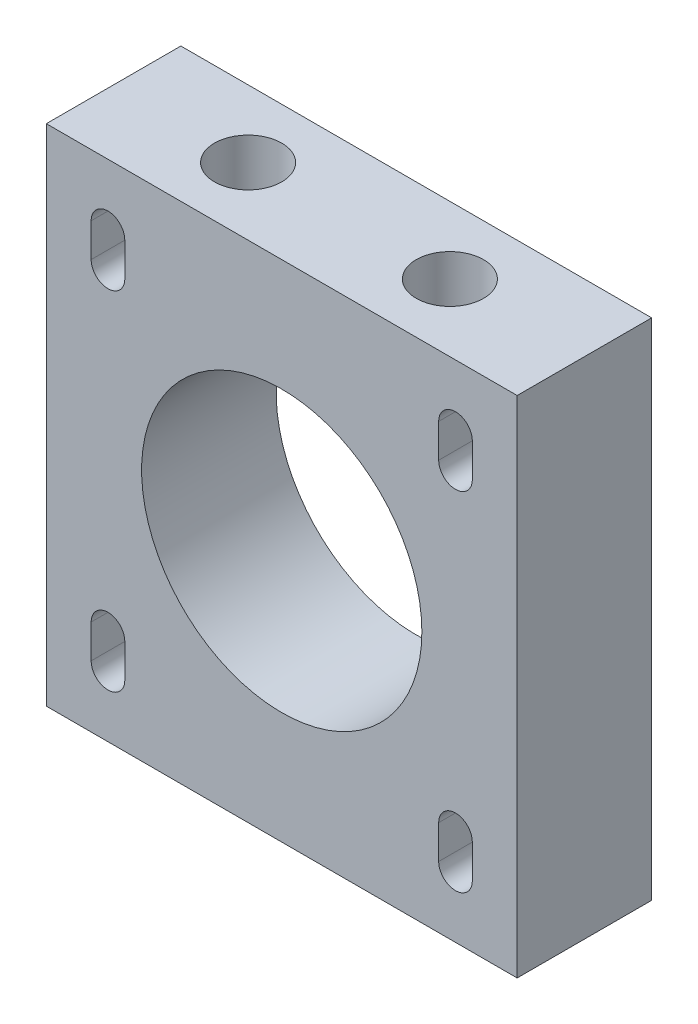
ISO-10303-21;
HEADER;
FILE_DESCRIPTION(('STEP AP214'),'2;1');
FILE_NAME('part.step','',(''),(''),'','','');
FILE_SCHEMA(('AUTOMOTIVE_DESIGN { 1 0 10303 214 1 1 1 1 }'));
ENDSEC;
DATA;
#1=APPLICATION_CONTEXT('core data for automotive mechanical design processes');
#2=APPLICATION_PROTOCOL_DEFINITION('international standard','automotive_design',2000,#1);
#3=PRODUCT_CONTEXT('',#1,'mechanical');
#4=PRODUCT('Part','Part','',(#3));
#5=PRODUCT_RELATED_PRODUCT_CATEGORY('part','',(#4));
#6=PRODUCT_DEFINITION_FORMATION('','',#4);
#7=PRODUCT_DEFINITION_CONTEXT('part definition',#1,'design');
#8=PRODUCT_DEFINITION('design','',#6,#7);
#9=PRODUCT_DEFINITION_SHAPE('','',#8);
#10=(LENGTH_UNIT() NAMED_UNIT(*) SI_UNIT(.MILLI.,.METRE.));
#11=(NAMED_UNIT(*) PLANE_ANGLE_UNIT() SI_UNIT($,.RADIAN.));
#12=(NAMED_UNIT(*) SI_UNIT($,.STERADIAN.) SOLID_ANGLE_UNIT());
#13=UNCERTAINTY_MEASURE_WITH_UNIT(LENGTH_MEASURE(1.E-05),#10,'distance_accuracy_value','');
#14=(GEOMETRIC_REPRESENTATION_CONTEXT(3) GLOBAL_UNCERTAINTY_ASSIGNED_CONTEXT((#13)) GLOBAL_UNIT_ASSIGNED_CONTEXT((#10,
#11,#12)) REPRESENTATION_CONTEXT('',''));
#15=CARTESIAN_POINT('',(0.,0.,0.));
#16=DIRECTION('',(0.,0.,1.));
#17=DIRECTION('',(1.,0.,0.));
#18=AXIS2_PLACEMENT_3D('',#15,#16,#17);
#19=CARTESIAN_POINT('',(0.,0.,12.));
#20=DIRECTION('',(0.,0.,1.));
#21=DIRECTION('',(1.,0.,0.));
#22=AXIS2_PLACEMENT_3D('',#19,#20,#21);
#23=PLANE('',#22);
#24=DIRECTION('',(0.,1.,0.));
#25=VECTOR('',#24,1.);
#26=CARTESIAN_POINT('',(-14.,-17.,12.));
#27=LINE('',#26,#25);
#28=CARTESIAN_POINT('',(-14.,-17.,12.));
#29=VERTEX_POINT('',#28);
#30=CARTESIAN_POINT('',(-14.,-14.,12.));
#31=VERTEX_POINT('',#30);
#32=EDGE_CURVE('E177',#29,#31,#27,.T.);
#33=ORIENTED_EDGE('',*,*,#32,.F.);
#34=CARTESIAN_POINT('',(-15.5,-17.,12.));
#35=DIRECTION('',(0.,0.,1.));
#36=DIRECTION('',(-1.,0.,0.));
#37=AXIS2_PLACEMENT_3D('',#34,#35,#36);
#38=CIRCLE('',#37,1.5);
#39=CARTESIAN_POINT('',(-17.,-17.,12.));
#40=VERTEX_POINT('',#39);
#41=EDGE_CURVE('E169',#40,#29,#38,.T.);
#42=ORIENTED_EDGE('',*,*,#41,.F.);
#43=DIRECTION('',(0.,-1.,0.));
#44=VECTOR('',#43,1.);
#45=CARTESIAN_POINT('',(-17.,-17.,12.));
#46=LINE('',#45,#44);
#47=CARTESIAN_POINT('',(-17.,-14.,12.));
#48=VERTEX_POINT('',#47);
#49=EDGE_CURVE('E192',#48,#40,#46,.T.);
#50=ORIENTED_EDGE('',*,*,#49,.F.);
#51=CARTESIAN_POINT('',(-15.5,-14.,12.));
#52=DIRECTION('',(0.,0.,1.));
#53=DIRECTION('',(-1.,0.,0.));
#54=AXIS2_PLACEMENT_3D('',#51,#52,#53);
#55=CIRCLE('',#54,1.5);
#56=EDGE_CURVE('E190',#31,#48,#55,.T.);
#57=ORIENTED_EDGE('',*,*,#56,.F.);
#58=EDGE_LOOP('',(#33,#42,#50,#57));
#59=FACE_BOUND('',#58,.T.);
#60=DIRECTION('',(0.,1.,0.));
#61=VECTOR('',#60,1.);
#62=CARTESIAN_POINT('',(17.,-17.,12.));
#63=LINE('',#62,#61);
#64=CARTESIAN_POINT('',(17.,-17.,12.));
#65=VERTEX_POINT('',#64);
#66=CARTESIAN_POINT('',(17.,-14.,12.));
#67=VERTEX_POINT('',#66);
#68=EDGE_CURVE('E210',#65,#67,#63,.T.);
#69=ORIENTED_EDGE('',*,*,#68,.F.);
#70=CARTESIAN_POINT('',(15.5,-17.,12.));
#71=DIRECTION('',(0.,0.,1.));
#72=DIRECTION('',(1.,0.,0.));
#73=AXIS2_PLACEMENT_3D('',#70,#71,#72);
#74=CIRCLE('',#73,1.5);
#75=CARTESIAN_POINT('',(14.,-17.,12.));
#76=VERTEX_POINT('',#75);
#77=EDGE_CURVE('E208',#76,#65,#74,.T.);
#78=ORIENTED_EDGE('',*,*,#77,.F.);
#79=DIRECTION('',(0.,-1.,0.));
#80=VECTOR('',#79,1.);
#81=CARTESIAN_POINT('',(14.,-17.,12.));
#82=LINE('',#81,#80);
#83=CARTESIAN_POINT('',(14.,-14.,12.));
#84=VERTEX_POINT('',#83);
#85=EDGE_CURVE('E216',#84,#76,#82,.T.);
#86=ORIENTED_EDGE('',*,*,#85,.F.);
#87=CARTESIAN_POINT('',(15.5,-14.,12.));
#88=DIRECTION('',(0.,0.,1.));
#89=DIRECTION('',(1.,0.,0.));
#90=AXIS2_PLACEMENT_3D('',#87,#88,#89);
#91=CIRCLE('',#90,1.5);
#92=EDGE_CURVE('E213',#67,#84,#91,.T.);
#93=ORIENTED_EDGE('',*,*,#92,.F.);
#94=EDGE_LOOP('',(#69,#78,#86,#93));
#95=FACE_BOUND('',#94,.T.);
#96=DIRECTION('',(0.,-1.,0.));
#97=VECTOR('',#96,1.);
#98=CARTESIAN_POINT('',(14.,17.,12.));
#99=LINE('',#98,#97);
#100=CARTESIAN_POINT('',(14.,17.,12.));
#101=VERTEX_POINT('',#100);
#102=CARTESIAN_POINT('',(14.,14.,12.));
#103=VERTEX_POINT('',#102);
#104=EDGE_CURVE('E241',#101,#103,#99,.T.);
#105=ORIENTED_EDGE('',*,*,#104,.F.);
#106=CARTESIAN_POINT('',(15.5,17.,12.));
#107=DIRECTION('',(0.,0.,1.));
#108=DIRECTION('',(-1.,0.,0.));
#109=AXIS2_PLACEMENT_3D('',#106,#107,#108);
#110=CIRCLE('',#109,1.50000000000001);
#111=CARTESIAN_POINT('',(17.,17.,12.));
#112=VERTEX_POINT('',#111);
#113=EDGE_CURVE('E239',#112,#101,#110,.T.);
#114=ORIENTED_EDGE('',*,*,#113,.F.);
#115=DIRECTION('',(0.,1.,0.));
#116=VECTOR('',#115,1.);
#117=CARTESIAN_POINT('',(17.,17.,12.));
#118=LINE('',#117,#116);
#119=CARTESIAN_POINT('',(17.,14.,12.));
#120=VERTEX_POINT('',#119);
#121=EDGE_CURVE('E247',#120,#112,#118,.T.);
#122=ORIENTED_EDGE('',*,*,#121,.F.);
#123=CARTESIAN_POINT('',(15.5,14.,12.));
#124=DIRECTION('',(0.,0.,1.));
#125=DIRECTION('',(-1.,0.,0.));
#126=AXIS2_PLACEMENT_3D('',#123,#124,#125);
#127=CIRCLE('',#126,1.50000000000001);
#128=EDGE_CURVE('E244',#103,#120,#127,.T.);
#129=ORIENTED_EDGE('',*,*,#128,.F.);
#130=EDGE_LOOP('',(#105,#114,#122,#129));
#131=FACE_BOUND('',#130,.T.);
#132=DIRECTION('',(0.,-1.,0.));
#133=VECTOR('',#132,1.);
#134=CARTESIAN_POINT('',(-17.,17.,12.));
#135=LINE('',#134,#133);
#136=CARTESIAN_POINT('',(-17.,17.,12.));
#137=VERTEX_POINT('',#136);
#138=CARTESIAN_POINT('',(-17.,14.,12.));
#139=VERTEX_POINT('',#138);
#140=EDGE_CURVE('E272',#137,#139,#135,.T.);
#141=ORIENTED_EDGE('',*,*,#140,.F.);
#142=CARTESIAN_POINT('',(-15.5,17.,12.));
#143=DIRECTION('',(0.,0.,1.));
#144=DIRECTION('',(1.,0.,0.));
#145=AXIS2_PLACEMENT_3D('',#142,#143,#144);
#146=CIRCLE('',#145,1.50000000000001);
#147=CARTESIAN_POINT('',(-14.,17.,12.));
#148=VERTEX_POINT('',#147);
#149=EDGE_CURVE('E270',#148,#137,#146,.T.);
#150=ORIENTED_EDGE('',*,*,#149,.F.);
#151=DIRECTION('',(0.,1.,0.));
#152=VECTOR('',#151,1.);
#153=CARTESIAN_POINT('',(-14.,17.,12.));
#154=LINE('',#153,#152);
#155=CARTESIAN_POINT('',(-14.,14.,12.));
#156=VERTEX_POINT('',#155);
#157=EDGE_CURVE('E278',#156,#148,#154,.T.);
#158=ORIENTED_EDGE('',*,*,#157,.F.);
#159=CARTESIAN_POINT('',(-15.5,14.,12.));
#160=DIRECTION('',(0.,0.,1.));
#161=DIRECTION('',(1.,0.,0.));
#162=AXIS2_PLACEMENT_3D('',#159,#160,#161);
#163=CIRCLE('',#162,1.50000000000001);
#164=EDGE_CURVE('E275',#139,#156,#163,.T.);
#165=ORIENTED_EDGE('',*,*,#164,.F.);
#166=EDGE_LOOP('',(#141,#150,#158,#165));
#167=FACE_BOUND('',#166,.T.);
#168=DIRECTION('',(0.,-1.,0.));
#169=VECTOR('',#168,1.);
#170=CARTESIAN_POINT('',(-21.,-22.5,12.));
#171=LINE('',#170,#169);
#172=CARTESIAN_POINT('',(-21.,22.5,12.));
#173=VERTEX_POINT('',#172);
#174=CARTESIAN_POINT('',(-21.,-22.5,12.));
#175=VERTEX_POINT('',#174);
#176=EDGE_CURVE('E301',#173,#175,#171,.T.);
#177=ORIENTED_EDGE('',*,*,#176,.T.);
#178=DIRECTION('',(1.,0.,0.));
#179=VECTOR('',#178,1.);
#180=CARTESIAN_POINT('',(21.,-22.5,12.));
#181=LINE('',#180,#179);
#182=CARTESIAN_POINT('',(21.,-22.5,12.));
#183=VERTEX_POINT('',#182);
#184=EDGE_CURVE('E304',#175,#183,#181,.T.);
#185=ORIENTED_EDGE('',*,*,#184,.T.);
#186=DIRECTION('',(0.,1.,0.));
#187=VECTOR('',#186,1.);
#188=CARTESIAN_POINT('',(21.,-22.5,12.));
#189=LINE('',#188,#187);
#190=CARTESIAN_POINT('',(21.,22.5,12.));
#191=VERTEX_POINT('',#190);
#192=EDGE_CURVE('E307',#183,#191,#189,.T.);
#193=ORIENTED_EDGE('',*,*,#192,.T.);
#194=DIRECTION('',(-1.,0.,0.));
#195=VECTOR('',#194,1.);
#196=CARTESIAN_POINT('',(21.,22.5,12.));
#197=LINE('',#196,#195);
#198=EDGE_CURVE('E309',#191,#173,#197,.T.);
#199=ORIENTED_EDGE('',*,*,#198,.T.);
#200=EDGE_LOOP('',(#177,#185,#193,#199));
#201=FACE_BOUND('',#200,.T.);
#202=CARTESIAN_POINT('',(0.,0.,12.));
#203=DIRECTION('',(0.,0.,1.));
#204=DIRECTION('',(1.,0.,0.));
#205=AXIS2_PLACEMENT_3D('',#202,#203,#204);
#206=CIRCLE('',#205,12.5);
#207=CARTESIAN_POINT('',(12.5,0.,12.));
#208=VERTEX_POINT('',#207);
#209=EDGE_CURVE('E198',#208,#208,#206,.T.);
#210=ORIENTED_EDGE('',*,*,#209,.F.);
#211=EDGE_LOOP('',(#210));
#212=FACE_BOUND('',#211,.T.);
#213=ADVANCED_FACE('F32',(#59,#95,#131,#167,#201,#212),#23,.T.);
#214=CARTESIAN_POINT('',(0.,0.,0.));
#215=DIRECTION('',(0.,0.,1.));
#216=DIRECTION('',(1.,0.,0.));
#217=AXIS2_PLACEMENT_3D('',#214,#215,#216);
#218=PLANE('',#217);
#219=CARTESIAN_POINT('',(15.5,-17.,0.));
#220=DIRECTION('',(0.,0.,1.));
#221=DIRECTION('',(1.,0.,0.));
#222=AXIS2_PLACEMENT_3D('',#219,#220,#221);
#223=CIRCLE('',#222,1.5);
#224=CARTESIAN_POINT('',(14.,-17.,0.));
#225=VERTEX_POINT('',#224);
#226=CARTESIAN_POINT('',(17.,-17.,0.));
#227=VERTEX_POINT('',#226);
#228=EDGE_CURVE('E185',#225,#227,#223,.T.);
#229=ORIENTED_EDGE('',*,*,#228,.T.);
#230=DIRECTION('',(0.,1.,0.));
#231=VECTOR('',#230,1.);
#232=CARTESIAN_POINT('',(17.,-17.,0.));
#233=LINE('',#232,#231);
#234=CARTESIAN_POINT('',(17.,-14.,0.));
#235=VERTEX_POINT('',#234);
#236=EDGE_CURVE('E221',#227,#235,#233,.T.);
#237=ORIENTED_EDGE('',*,*,#236,.T.);
#238=CARTESIAN_POINT('',(15.5,-14.,0.));
#239=DIRECTION('',(0.,0.,1.));
#240=DIRECTION('',(1.,0.,0.));
#241=AXIS2_PLACEMENT_3D('',#238,#239,#240);
#242=CIRCLE('',#241,1.5);
#243=CARTESIAN_POINT('',(14.,-14.,0.));
#244=VERTEX_POINT('',#243);
#245=EDGE_CURVE('E224',#235,#244,#242,.T.);
#246=ORIENTED_EDGE('',*,*,#245,.T.);
#247=DIRECTION('',(0.,-1.,0.));
#248=VECTOR('',#247,1.);
#249=CARTESIAN_POINT('',(14.,-17.,0.));
#250=LINE('',#249,#248);
#251=EDGE_CURVE('E211',#244,#225,#250,.T.);
#252=ORIENTED_EDGE('',*,*,#251,.T.);
#253=EDGE_LOOP('',(#229,#237,#246,#252));
#254=FACE_BOUND('',#253,.T.);
#255=CARTESIAN_POINT('',(-15.5,17.,0.));
#256=DIRECTION('',(0.,0.,1.));
#257=DIRECTION('',(1.,0.,0.));
#258=AXIS2_PLACEMENT_3D('',#255,#256,#257);
#259=CIRCLE('',#258,1.50000000000001);
#260=CARTESIAN_POINT('',(-14.,17.,0.));
#261=VERTEX_POINT('',#260);
#262=CARTESIAN_POINT('',(-17.,17.,0.));
#263=VERTEX_POINT('',#262);
#264=EDGE_CURVE('E269',#261,#263,#259,.T.);
#265=ORIENTED_EDGE('',*,*,#264,.T.);
#266=DIRECTION('',(0.,-1.,0.));
#267=VECTOR('',#266,1.);
#268=CARTESIAN_POINT('',(-17.,17.,0.));
#269=LINE('',#268,#267);
#270=CARTESIAN_POINT('',(-17.,14.,0.));
#271=VERTEX_POINT('',#270);
#272=EDGE_CURVE('E283',#263,#271,#269,.T.);
#273=ORIENTED_EDGE('',*,*,#272,.T.);
#274=CARTESIAN_POINT('',(-15.5,14.,0.));
#275=DIRECTION('',(0.,0.,1.));
#276=DIRECTION('',(1.,0.,0.));
#277=AXIS2_PLACEMENT_3D('',#274,#275,#276);
#278=CIRCLE('',#277,1.50000000000001);
#279=CARTESIAN_POINT('',(-14.,14.,0.));
#280=VERTEX_POINT('',#279);
#281=EDGE_CURVE('E286',#271,#280,#278,.T.);
#282=ORIENTED_EDGE('',*,*,#281,.T.);
#283=DIRECTION('',(0.,1.,0.));
#284=VECTOR('',#283,1.);
#285=CARTESIAN_POINT('',(-14.,17.,0.));
#286=LINE('',#285,#284);
#287=EDGE_CURVE('E273',#280,#261,#286,.T.);
#288=ORIENTED_EDGE('',*,*,#287,.T.);
#289=EDGE_LOOP('',(#265,#273,#282,#288));
#290=FACE_BOUND('',#289,.T.);
#291=DIRECTION('',(0.,-1.,0.));
#292=VECTOR('',#291,1.);
#293=CARTESIAN_POINT('',(-21.,-22.5,0.));
#294=LINE('',#293,#292);
#295=CARTESIAN_POINT('',(-21.,22.5,0.));
#296=VERTEX_POINT('',#295);
#297=CARTESIAN_POINT('',(-21.,-22.5,0.));
#298=VERTEX_POINT('',#297);
#299=EDGE_CURVE('E300',#296,#298,#294,.T.);
#300=ORIENTED_EDGE('',*,*,#299,.F.);
#301=DIRECTION('',(-1.,0.,0.));
#302=VECTOR('',#301,1.);
#303=CARTESIAN_POINT('',(21.,22.5,0.));
#304=LINE('',#303,#302);
#305=CARTESIAN_POINT('',(21.,22.5,0.));
#306=VERTEX_POINT('',#305);
#307=EDGE_CURVE('E305',#306,#296,#304,.T.);
#308=ORIENTED_EDGE('',*,*,#307,.F.);
#309=DIRECTION('',(0.,1.,0.));
#310=VECTOR('',#309,1.);
#311=CARTESIAN_POINT('',(21.,-22.5,0.));
#312=LINE('',#311,#310);
#313=CARTESIAN_POINT('',(21.,-22.5,0.));
#314=VERTEX_POINT('',#313);
#315=EDGE_CURVE('E316',#314,#306,#312,.T.);
#316=ORIENTED_EDGE('',*,*,#315,.F.);
#317=DIRECTION('',(1.,0.,0.));
#318=VECTOR('',#317,1.);
#319=CARTESIAN_POINT('',(21.,-22.5,0.));
#320=LINE('',#319,#318);
#321=EDGE_CURVE('E314',#298,#314,#320,.T.);
#322=ORIENTED_EDGE('',*,*,#321,.F.);
#323=EDGE_LOOP('',(#300,#308,#316,#322));
#324=FACE_BOUND('',#323,.T.);
#325=CARTESIAN_POINT('',(15.5,17.,0.));
#326=DIRECTION('',(0.,0.,1.));
#327=DIRECTION('',(-1.,0.,0.));
#328=AXIS2_PLACEMENT_3D('',#325,#326,#327);
#329=CIRCLE('',#328,1.50000000000001);
#330=CARTESIAN_POINT('',(17.,17.,0.));
#331=VERTEX_POINT('',#330);
#332=CARTESIAN_POINT('',(14.,17.,0.));
#333=VERTEX_POINT('',#332);
#334=EDGE_CURVE('E238',#331,#333,#329,.T.);
#335=ORIENTED_EDGE('',*,*,#334,.T.);
#336=DIRECTION('',(0.,-1.,0.));
#337=VECTOR('',#336,1.);
#338=CARTESIAN_POINT('',(14.,17.,0.));
#339=LINE('',#338,#337);
#340=CARTESIAN_POINT('',(14.,14.,0.));
#341=VERTEX_POINT('',#340);
#342=EDGE_CURVE('E252',#333,#341,#339,.T.);
#343=ORIENTED_EDGE('',*,*,#342,.T.);
#344=CARTESIAN_POINT('',(15.5,14.,0.));
#345=DIRECTION('',(0.,0.,1.));
#346=DIRECTION('',(-1.,0.,0.));
#347=AXIS2_PLACEMENT_3D('',#344,#345,#346);
#348=CIRCLE('',#347,1.50000000000001);
#349=CARTESIAN_POINT('',(17.,14.,0.));
#350=VERTEX_POINT('',#349);
#351=EDGE_CURVE('E255',#341,#350,#348,.T.);
#352=ORIENTED_EDGE('',*,*,#351,.T.);
#353=DIRECTION('',(0.,1.,0.));
#354=VECTOR('',#353,1.);
#355=CARTESIAN_POINT('',(17.,17.,0.));
#356=LINE('',#355,#354);
#357=EDGE_CURVE('E242',#350,#331,#356,.T.);
#358=ORIENTED_EDGE('',*,*,#357,.T.);
#359=EDGE_LOOP('',(#335,#343,#352,#358));
#360=FACE_BOUND('',#359,.T.);
#361=CARTESIAN_POINT('',(-15.5,-17.,0.));
#362=DIRECTION('',(0.,0.,1.));
#363=DIRECTION('',(-1.,0.,0.));
#364=AXIS2_PLACEMENT_3D('',#361,#362,#363);
#365=CIRCLE('',#364,1.5);
#366=CARTESIAN_POINT('',(-17.,-17.,0.));
#367=VERTEX_POINT('',#366);
#368=CARTESIAN_POINT('',(-14.,-17.,0.));
#369=VERTEX_POINT('',#368);
#370=EDGE_CURVE('E55',#367,#369,#365,.T.);
#371=ORIENTED_EDGE('',*,*,#370,.T.);
#372=DIRECTION('',(0.,1.,0.));
#373=VECTOR('',#372,1.);
#374=CARTESIAN_POINT('',(-14.,-17.,0.));
#375=LINE('',#374,#373);
#376=CARTESIAN_POINT('',(-14.,-14.,0.));
#377=VERTEX_POINT('',#376);
#378=EDGE_CURVE('E184',#369,#377,#375,.T.);
#379=ORIENTED_EDGE('',*,*,#378,.T.);
#380=CARTESIAN_POINT('',(-15.5,-14.,0.));
#381=DIRECTION('',(0.,0.,1.));
#382=DIRECTION('',(-1.,0.,0.));
#383=AXIS2_PLACEMENT_3D('',#380,#381,#382);
#384=CIRCLE('',#383,1.5);
#385=CARTESIAN_POINT('',(-17.,-14.,0.));
#386=VERTEX_POINT('',#385);
#387=EDGE_CURVE('E200',#377,#386,#384,.T.);
#388=ORIENTED_EDGE('',*,*,#387,.T.);
#389=DIRECTION('',(0.,-1.,0.));
#390=VECTOR('',#389,1.);
#391=CARTESIAN_POINT('',(-17.,-17.,0.));
#392=LINE('',#391,#390);
#393=EDGE_CURVE('E178',#386,#367,#392,.T.);
#394=ORIENTED_EDGE('',*,*,#393,.T.);
#395=EDGE_LOOP('',(#371,#379,#388,#394));
#396=FACE_BOUND('',#395,.T.);
#397=CARTESIAN_POINT('',(0.,0.,0.));
#398=DIRECTION('',(0.,0.,1.));
#399=DIRECTION('',(1.,0.,0.));
#400=AXIS2_PLACEMENT_3D('',#397,#398,#399);
#401=CIRCLE('',#400,12.5);
#402=CARTESIAN_POINT('',(12.5,0.,0.));
#403=VERTEX_POINT('',#402);
#404=EDGE_CURVE('E387',#403,#403,#401,.T.);
#405=ORIENTED_EDGE('',*,*,#404,.T.);
#406=EDGE_LOOP('',(#405));
#407=FACE_BOUND('',#406,.T.);
#408=ADVANCED_FACE('F334',(#254,#290,#324,#360,#396,#407),#218,.F.);
#409=CARTESIAN_POINT('',(-21.,-22.5,12.));
#410=DIRECTION('',(1.,0.,0.));
#411=DIRECTION('',(0.,0.,-1.));
#412=AXIS2_PLACEMENT_3D('',#409,#410,#411);
#413=PLANE('',#412);
#414=ORIENTED_EDGE('',*,*,#299,.T.);
#415=DIRECTION('',(0.,0.,-1.));
#416=VECTOR('',#415,1.);
#417=CARTESIAN_POINT('',(-21.,-22.5,12.));
#418=LINE('',#417,#416);
#419=EDGE_CURVE('E11',#175,#298,#418,.T.);
#420=ORIENTED_EDGE('',*,*,#419,.F.);
#421=ORIENTED_EDGE('',*,*,#176,.F.);
#422=DIRECTION('',(0.,0.,-1.));
#423=VECTOR('',#422,1.);
#424=CARTESIAN_POINT('',(-21.,22.5,12.));
#425=LINE('',#424,#423);
#426=EDGE_CURVE('E311',#173,#296,#425,.T.);
#427=ORIENTED_EDGE('',*,*,#426,.T.);
#428=EDGE_LOOP('',(#414,#420,#421,#427));
#429=FACE_BOUND('',#428,.T.);
#430=ADVANCED_FACE('F34',(#429),#413,.F.);
#431=CARTESIAN_POINT('',(21.,-22.5,12.));
#432=DIRECTION('',(0.,1.,0.));
#433=DIRECTION('',(-1.,0.,0.));
#434=AXIS2_PLACEMENT_3D('',#431,#432,#433);
#435=PLANE('',#434);
#436=ORIENTED_EDGE('',*,*,#321,.T.);
#437=DIRECTION('',(0.,0.,-1.));
#438=VECTOR('',#437,1.);
#439=CARTESIAN_POINT('',(21.,-22.5,12.));
#440=LINE('',#439,#438);
#441=EDGE_CURVE('E40',#183,#314,#440,.T.);
#442=ORIENTED_EDGE('',*,*,#441,.F.);
#443=ORIENTED_EDGE('',*,*,#184,.F.);
#444=ORIENTED_EDGE('',*,*,#419,.T.);
#445=EDGE_LOOP('',(#436,#442,#443,#444));
#446=FACE_BOUND('',#445,.T.);
#447=ADVANCED_FACE('F345',(#446),#435,.F.);
#448=CARTESIAN_POINT('',(21.,-22.5,12.));
#449=DIRECTION('',(-1.,0.,0.));
#450=DIRECTION('',(0.,0.,1.));
#451=AXIS2_PLACEMENT_3D('',#448,#449,#450);
#452=PLANE('',#451);
#453=ORIENTED_EDGE('',*,*,#315,.T.);
#454=DIRECTION('',(0.,0.,-1.));
#455=VECTOR('',#454,1.);
#456=CARTESIAN_POINT('',(21.,22.5,12.));
#457=LINE('',#456,#455);
#458=EDGE_CURVE('E321',#191,#306,#457,.T.);
#459=ORIENTED_EDGE('',*,*,#458,.F.);
#460=ORIENTED_EDGE('',*,*,#192,.F.);
#461=ORIENTED_EDGE('',*,*,#441,.T.);
#462=EDGE_LOOP('',(#453,#459,#460,#461));
#463=FACE_BOUND('',#462,.T.);
#464=ADVANCED_FACE('F328',(#463),#452,.F.);
#465=CARTESIAN_POINT('',(21.,22.5,12.));
#466=DIRECTION('',(0.,-1.,0.));
#467=DIRECTION('',(1.,0.,0.));
#468=AXIS2_PLACEMENT_3D('',#465,#466,#467);
#469=PLANE('',#468);
#470=CARTESIAN_POINT('',(-9.,22.5,6.));
#471=DIRECTION('',(0.,1.,0.));
#472=DIRECTION('',(-1.,0.,0.));
#473=AXIS2_PLACEMENT_3D('',#470,#471,#472);
#474=CIRCLE('',#473,3.);
#475=CARTESIAN_POINT('',(-12.,22.5,6.));
#476=VERTEX_POINT('',#475);
#477=EDGE_CURVE('E375',#476,#476,#474,.T.);
#478=ORIENTED_EDGE('',*,*,#477,.F.);
#479=EDGE_LOOP('',(#478));
#480=FACE_BOUND('',#479,.T.);
#481=CARTESIAN_POINT('',(9.,22.5,6.));
#482=DIRECTION('',(0.,1.,0.));
#483=DIRECTION('',(-1.,0.,0.));
#484=AXIS2_PLACEMENT_3D('',#481,#482,#483);
#485=CIRCLE('',#484,3.);
#486=CARTESIAN_POINT('',(6.,22.5,6.));
#487=VERTEX_POINT('',#486);
#488=EDGE_CURVE('E378',#487,#487,#485,.T.);
#489=ORIENTED_EDGE('',*,*,#488,.F.);
#490=EDGE_LOOP('',(#489));
#491=FACE_BOUND('',#490,.T.);
#492=ORIENTED_EDGE('',*,*,#307,.T.);
#493=ORIENTED_EDGE('',*,*,#426,.F.);
#494=ORIENTED_EDGE('',*,*,#198,.F.);
#495=ORIENTED_EDGE('',*,*,#458,.T.);
#496=EDGE_LOOP('',(#492,#493,#494,#495));
#497=FACE_BOUND('',#496,.T.);
#498=ADVANCED_FACE('F338',(#480,#491,#497),#469,.F.);
#499=CARTESIAN_POINT('',(-15.5,17.,12.));
#500=DIRECTION('',(0.,0.,-1.));
#501=DIRECTION('',(-1.,0.,0.));
#502=AXIS2_PLACEMENT_3D('',#499,#500,#501);
#503=CYLINDRICAL_SURFACE('',#502,1.50000000000001);
#504=ORIENTED_EDGE('',*,*,#264,.F.);
#505=DIRECTION('',(0.,0.,-1.));
#506=VECTOR('',#505,1.);
#507=CARTESIAN_POINT('',(-14.,17.,12.));
#508=LINE('',#507,#506);
#509=EDGE_CURVE('E280',#148,#261,#508,.T.);
#510=ORIENTED_EDGE('',*,*,#509,.F.);
#511=ORIENTED_EDGE('',*,*,#149,.T.);
#512=DIRECTION('',(0.,0.,-1.));
#513=VECTOR('',#512,1.);
#514=CARTESIAN_POINT('',(-17.,17.,12.));
#515=LINE('',#514,#513);
#516=EDGE_CURVE('E297',#137,#263,#515,.T.);
#517=ORIENTED_EDGE('',*,*,#516,.T.);
#518=EDGE_LOOP('',(#504,#510,#511,#517));
#519=FACE_BOUND('',#518,.T.);
#520=ADVANCED_FACE('F360',(#519),#503,.F.);
#521=CARTESIAN_POINT('',(-17.,17.,12.));
#522=DIRECTION('',(1.,0.,0.));
#523=DIRECTION('',(0.,0.,-1.));
#524=AXIS2_PLACEMENT_3D('',#521,#522,#523);
#525=PLANE('',#524);
#526=ORIENTED_EDGE('',*,*,#272,.F.);
#527=ORIENTED_EDGE('',*,*,#516,.F.);
#528=ORIENTED_EDGE('',*,*,#140,.T.);
#529=DIRECTION('',(0.,0.,-1.));
#530=VECTOR('',#529,1.);
#531=CARTESIAN_POINT('',(-17.,14.,12.));
#532=LINE('',#531,#530);
#533=EDGE_CURVE('E295',#139,#271,#532,.T.);
#534=ORIENTED_EDGE('',*,*,#533,.T.);
#535=EDGE_LOOP('',(#526,#527,#528,#534));
#536=FACE_BOUND('',#535,.T.);
#537=ADVANCED_FACE('F370',(#536),#525,.T.);
#538=CARTESIAN_POINT('',(-15.5,14.,12.));
#539=DIRECTION('',(0.,0.,-1.));
#540=DIRECTION('',(-1.,0.,0.));
#541=AXIS2_PLACEMENT_3D('',#538,#539,#540);
#542=CYLINDRICAL_SURFACE('',#541,1.50000000000001);
#543=ORIENTED_EDGE('',*,*,#281,.F.);
#544=ORIENTED_EDGE('',*,*,#533,.F.);
#545=ORIENTED_EDGE('',*,*,#164,.T.);
#546=DIRECTION('',(0.,0.,-1.));
#547=VECTOR('',#546,1.);
#548=CARTESIAN_POINT('',(-14.,14.,12.));
#549=LINE('',#548,#547);
#550=EDGE_CURVE('E293',#156,#280,#549,.T.);
#551=ORIENTED_EDGE('',*,*,#550,.T.);
#552=EDGE_LOOP('',(#543,#544,#545,#551));
#553=FACE_BOUND('',#552,.T.);
#554=ADVANCED_FACE('F465',(#553),#542,.F.);
#555=CARTESIAN_POINT('',(-14.,17.,12.));
#556=DIRECTION('',(-1.,0.,0.));
#557=DIRECTION('',(0.,0.,1.));
#558=AXIS2_PLACEMENT_3D('',#555,#556,#557);
#559=PLANE('',#558);
#560=ORIENTED_EDGE('',*,*,#287,.F.);
#561=ORIENTED_EDGE('',*,*,#550,.F.);
#562=ORIENTED_EDGE('',*,*,#157,.T.);
#563=ORIENTED_EDGE('',*,*,#509,.T.);
#564=EDGE_LOOP('',(#560,#561,#562,#563));
#565=FACE_BOUND('',#564,.T.);
#566=ADVANCED_FACE('F461',(#565),#559,.T.);
#567=CARTESIAN_POINT('',(15.5,17.,12.));
#568=DIRECTION('',(0.,0.,-1.));
#569=DIRECTION('',(-1.,0.,0.));
#570=AXIS2_PLACEMENT_3D('',#567,#568,#569);
#571=CYLINDRICAL_SURFACE('',#570,1.50000000000001);
#572=ORIENTED_EDGE('',*,*,#334,.F.);
#573=DIRECTION('',(0.,0.,-1.));
#574=VECTOR('',#573,1.);
#575=CARTESIAN_POINT('',(17.,17.,12.));
#576=LINE('',#575,#574);
#577=EDGE_CURVE('E249',#112,#331,#576,.T.);
#578=ORIENTED_EDGE('',*,*,#577,.F.);
#579=ORIENTED_EDGE('',*,*,#113,.T.);
#580=DIRECTION('',(0.,0.,-1.));
#581=VECTOR('',#580,1.);
#582=CARTESIAN_POINT('',(14.,17.,12.));
#583=LINE('',#582,#581);
#584=EDGE_CURVE('E266',#101,#333,#583,.T.);
#585=ORIENTED_EDGE('',*,*,#584,.T.);
#586=EDGE_LOOP('',(#572,#578,#579,#585));
#587=FACE_BOUND('',#586,.T.);
#588=ADVANCED_FACE('F457',(#587),#571,.F.);
#589=CARTESIAN_POINT('',(14.,17.,12.));
#590=DIRECTION('',(1.,0.,0.));
#591=DIRECTION('',(0.,0.,-1.));
#592=AXIS2_PLACEMENT_3D('',#589,#590,#591);
#593=PLANE('',#592);
#594=ORIENTED_EDGE('',*,*,#342,.F.);
#595=ORIENTED_EDGE('',*,*,#584,.F.);
#596=ORIENTED_EDGE('',*,*,#104,.T.);
#597=DIRECTION('',(0.,0.,-1.));
#598=VECTOR('',#597,1.);
#599=CARTESIAN_POINT('',(14.,14.,12.));
#600=LINE('',#599,#598);
#601=EDGE_CURVE('E264',#103,#341,#600,.T.);
#602=ORIENTED_EDGE('',*,*,#601,.T.);
#603=EDGE_LOOP('',(#594,#595,#596,#602));
#604=FACE_BOUND('',#603,.T.);
#605=ADVANCED_FACE('F453',(#604),#593,.T.);
#606=CARTESIAN_POINT('',(15.5,14.,12.));
#607=DIRECTION('',(0.,0.,-1.));
#608=DIRECTION('',(-1.,0.,0.));
#609=AXIS2_PLACEMENT_3D('',#606,#607,#608);
#610=CYLINDRICAL_SURFACE('',#609,1.50000000000001);
#611=ORIENTED_EDGE('',*,*,#351,.F.);
#612=ORIENTED_EDGE('',*,*,#601,.F.);
#613=ORIENTED_EDGE('',*,*,#128,.T.);
#614=DIRECTION('',(0.,0.,-1.));
#615=VECTOR('',#614,1.);
#616=CARTESIAN_POINT('',(17.,14.,12.));
#617=LINE('',#616,#615);
#618=EDGE_CURVE('E262',#120,#350,#617,.T.);
#619=ORIENTED_EDGE('',*,*,#618,.T.);
#620=EDGE_LOOP('',(#611,#612,#613,#619));
#621=FACE_BOUND('',#620,.T.);
#622=ADVANCED_FACE('F449',(#621),#610,.F.);
#623=CARTESIAN_POINT('',(17.,17.,12.));
#624=DIRECTION('',(-1.,0.,0.));
#625=DIRECTION('',(0.,0.,1.));
#626=AXIS2_PLACEMENT_3D('',#623,#624,#625);
#627=PLANE('',#626);
#628=ORIENTED_EDGE('',*,*,#357,.F.);
#629=ORIENTED_EDGE('',*,*,#618,.F.);
#630=ORIENTED_EDGE('',*,*,#121,.T.);
#631=ORIENTED_EDGE('',*,*,#577,.T.);
#632=EDGE_LOOP('',(#628,#629,#630,#631));
#633=FACE_BOUND('',#632,.T.);
#634=ADVANCED_FACE('F445',(#633),#627,.T.);
#635=CARTESIAN_POINT('',(15.5,-17.,12.));
#636=DIRECTION('',(0.,0.,-1.));
#637=DIRECTION('',(-1.,0.,0.));
#638=AXIS2_PLACEMENT_3D('',#635,#636,#637);
#639=CYLINDRICAL_SURFACE('',#638,1.5);
#640=ORIENTED_EDGE('',*,*,#228,.F.);
#641=DIRECTION('',(0.,0.,-1.));
#642=VECTOR('',#641,1.);
#643=CARTESIAN_POINT('',(14.,-17.,12.));
#644=LINE('',#643,#642);
#645=EDGE_CURVE('E218',#76,#225,#644,.T.);
#646=ORIENTED_EDGE('',*,*,#645,.F.);
#647=ORIENTED_EDGE('',*,*,#77,.T.);
#648=DIRECTION('',(0.,0.,-1.));
#649=VECTOR('',#648,1.);
#650=CARTESIAN_POINT('',(17.,-17.,12.));
#651=LINE('',#650,#649);
#652=EDGE_CURVE('E235',#65,#227,#651,.T.);
#653=ORIENTED_EDGE('',*,*,#652,.T.);
#654=EDGE_LOOP('',(#640,#646,#647,#653));
#655=FACE_BOUND('',#654,.T.);
#656=ADVANCED_FACE('F441',(#655),#639,.F.);
#657=CARTESIAN_POINT('',(17.,-17.,12.));
#658=DIRECTION('',(-1.,0.,0.));
#659=DIRECTION('',(0.,0.,1.));
#660=AXIS2_PLACEMENT_3D('',#657,#658,#659);
#661=PLANE('',#660);
#662=ORIENTED_EDGE('',*,*,#236,.F.);
#663=ORIENTED_EDGE('',*,*,#652,.F.);
#664=ORIENTED_EDGE('',*,*,#68,.T.);
#665=DIRECTION('',(0.,0.,-1.));
#666=VECTOR('',#665,1.);
#667=CARTESIAN_POINT('',(17.,-14.,12.));
#668=LINE('',#667,#666);
#669=EDGE_CURVE('E233',#67,#235,#668,.T.);
#670=ORIENTED_EDGE('',*,*,#669,.T.);
#671=EDGE_LOOP('',(#662,#663,#664,#670));
#672=FACE_BOUND('',#671,.T.);
#673=ADVANCED_FACE('F437',(#672),#661,.T.);
#674=CARTESIAN_POINT('',(15.5,-14.,12.));
#675=DIRECTION('',(0.,0.,-1.));
#676=DIRECTION('',(-1.,0.,0.));
#677=AXIS2_PLACEMENT_3D('',#674,#675,#676);
#678=CYLINDRICAL_SURFACE('',#677,1.5);
#679=ORIENTED_EDGE('',*,*,#245,.F.);
#680=ORIENTED_EDGE('',*,*,#669,.F.);
#681=ORIENTED_EDGE('',*,*,#92,.T.);
#682=DIRECTION('',(0.,0.,-1.));
#683=VECTOR('',#682,1.);
#684=CARTESIAN_POINT('',(14.,-14.,12.));
#685=LINE('',#684,#683);
#686=EDGE_CURVE('E231',#84,#244,#685,.T.);
#687=ORIENTED_EDGE('',*,*,#686,.T.);
#688=EDGE_LOOP('',(#679,#680,#681,#687));
#689=FACE_BOUND('',#688,.T.);
#690=ADVANCED_FACE('F433',(#689),#678,.F.);
#691=CARTESIAN_POINT('',(14.,-17.,12.));
#692=DIRECTION('',(1.,0.,0.));
#693=DIRECTION('',(0.,0.,-1.));
#694=AXIS2_PLACEMENT_3D('',#691,#692,#693);
#695=PLANE('',#694);
#696=ORIENTED_EDGE('',*,*,#251,.F.);
#697=ORIENTED_EDGE('',*,*,#686,.F.);
#698=ORIENTED_EDGE('',*,*,#85,.T.);
#699=ORIENTED_EDGE('',*,*,#645,.T.);
#700=EDGE_LOOP('',(#696,#697,#698,#699));
#701=FACE_BOUND('',#700,.T.);
#702=ADVANCED_FACE('F430',(#701),#695,.T.);
#703=CARTESIAN_POINT('',(-15.5,-17.,12.));
#704=DIRECTION('',(0.,0.,-1.));
#705=DIRECTION('',(-1.,0.,0.));
#706=AXIS2_PLACEMENT_3D('',#703,#704,#705);
#707=CYLINDRICAL_SURFACE('',#706,1.5);
#708=ORIENTED_EDGE('',*,*,#370,.F.);
#709=DIRECTION('',(0.,0.,-1.));
#710=VECTOR('',#709,1.);
#711=CARTESIAN_POINT('',(-17.,-17.,12.));
#712=LINE('',#711,#710);
#713=EDGE_CURVE('E173',#40,#367,#712,.T.);
#714=ORIENTED_EDGE('',*,*,#713,.F.);
#715=ORIENTED_EDGE('',*,*,#41,.T.);
#716=DIRECTION('',(0.,0.,-1.));
#717=VECTOR('',#716,1.);
#718=CARTESIAN_POINT('',(-14.,-17.,12.));
#719=LINE('',#718,#717);
#720=EDGE_CURVE('E172',#29,#369,#719,.T.);
#721=ORIENTED_EDGE('',*,*,#720,.T.);
#722=EDGE_LOOP('',(#708,#714,#715,#721));
#723=FACE_BOUND('',#722,.T.);
#724=ADVANCED_FACE('F171',(#723),#707,.F.);
#725=CARTESIAN_POINT('',(-14.,-17.,12.));
#726=DIRECTION('',(-1.,0.,0.));
#727=DIRECTION('',(0.,0.,1.));
#728=AXIS2_PLACEMENT_3D('',#725,#726,#727);
#729=PLANE('',#728);
#730=ORIENTED_EDGE('',*,*,#378,.F.);
#731=ORIENTED_EDGE('',*,*,#720,.F.);
#732=ORIENTED_EDGE('',*,*,#32,.T.);
#733=DIRECTION('',(0.,0.,-1.));
#734=VECTOR('',#733,1.);
#735=CARTESIAN_POINT('',(-14.,-14.,12.));
#736=LINE('',#735,#734);
#737=EDGE_CURVE('E186',#31,#377,#736,.T.);
#738=ORIENTED_EDGE('',*,*,#737,.T.);
#739=EDGE_LOOP('',(#730,#731,#732,#738));
#740=FACE_BOUND('',#739,.T.);
#741=ADVANCED_FACE('F181',(#740),#729,.T.);
#742=CARTESIAN_POINT('',(-15.5,-14.,12.));
#743=DIRECTION('',(0.,0.,-1.));
#744=DIRECTION('',(-1.,0.,0.));
#745=AXIS2_PLACEMENT_3D('',#742,#743,#744);
#746=CYLINDRICAL_SURFACE('',#745,1.5);
#747=ORIENTED_EDGE('',*,*,#387,.F.);
#748=ORIENTED_EDGE('',*,*,#737,.F.);
#749=ORIENTED_EDGE('',*,*,#56,.T.);
#750=DIRECTION('',(0.,0.,-1.));
#751=VECTOR('',#750,1.);
#752=CARTESIAN_POINT('',(-17.,-14.,12.));
#753=LINE('',#752,#751);
#754=EDGE_CURVE('E47',#48,#386,#753,.T.);
#755=ORIENTED_EDGE('',*,*,#754,.T.);
#756=EDGE_LOOP('',(#747,#748,#749,#755));
#757=FACE_BOUND('',#756,.T.);
#758=ADVANCED_FACE('F422',(#757),#746,.F.);
#759=CARTESIAN_POINT('',(-17.,-17.,12.));
#760=DIRECTION('',(1.,0.,0.));
#761=DIRECTION('',(0.,0.,-1.));
#762=AXIS2_PLACEMENT_3D('',#759,#760,#761);
#763=PLANE('',#762);
#764=ORIENTED_EDGE('',*,*,#393,.F.);
#765=ORIENTED_EDGE('',*,*,#754,.F.);
#766=ORIENTED_EDGE('',*,*,#49,.T.);
#767=ORIENTED_EDGE('',*,*,#713,.T.);
#768=EDGE_LOOP('',(#764,#765,#766,#767));
#769=FACE_BOUND('',#768,.T.);
#770=ADVANCED_FACE('F418',(#769),#763,.T.);
#771=CARTESIAN_POINT('',(0.,0.,12.));
#772=DIRECTION('',(0.,0.,-1.));
#773=DIRECTION('',(-1.,0.,0.));
#774=AXIS2_PLACEMENT_3D('',#771,#772,#773);
#775=CYLINDRICAL_SURFACE('',#774,12.5);
#776=ORIENTED_EDGE('',*,*,#209,.T.);
#777=EDGE_LOOP('',(#776));
#778=FACE_BOUND('',#777,.T.);
#779=ORIENTED_EDGE('',*,*,#404,.F.);
#780=EDGE_LOOP('',(#779));
#781=FACE_BOUND('',#780,.T.);
#782=ADVANCED_FACE('F414',(#778,#781),#775,.F.);
#783=CARTESIAN_POINT('',(9.,12.5,6.));
#784=DIRECTION('',(0.,1.,0.));
#785=DIRECTION('',(-1.,0.,0.));
#786=AXIS2_PLACEMENT_3D('',#783,#784,#785);
#787=CYLINDRICAL_SURFACE('',#786,3.);
#788=CARTESIAN_POINT('',(9.,12.5,6.));
#789=DIRECTION('',(0.,1.,0.));
#790=DIRECTION('',(-1.,0.,0.));
#791=AXIS2_PLACEMENT_3D('',#788,#789,#790);
#792=CIRCLE('',#791,3.);
#793=CARTESIAN_POINT('',(6.,12.5,6.));
#794=VERTEX_POINT('',#793);
#795=EDGE_CURVE('E380',#794,#794,#792,.T.);
#796=ORIENTED_EDGE('',*,*,#795,.F.);
#797=EDGE_LOOP('',(#796));
#798=FACE_BOUND('',#797,.T.);
#799=ORIENTED_EDGE('',*,*,#488,.T.);
#800=EDGE_LOOP('',(#799));
#801=FACE_BOUND('',#800,.T.);
#802=ADVANCED_FACE('F408',(#798,#801),#787,.F.);
#803=CARTESIAN_POINT('',(9.,12.5,6.));
#804=DIRECTION('',(0.,1.,0.));
#805=DIRECTION('',(-1.,0.,0.));
#806=AXIS2_PLACEMENT_3D('',#803,#804,#805);
#807=PLANE('',#806);
#808=ORIENTED_EDGE('',*,*,#795,.T.);
#809=EDGE_LOOP('',(#808));
#810=FACE_BOUND('',#809,.T.);
#811=ADVANCED_FACE('F400',(#810),#807,.T.);
#812=CARTESIAN_POINT('',(-9.,12.5,6.));
#813=DIRECTION('',(0.,1.,0.));
#814=DIRECTION('',(-1.,0.,0.));
#815=AXIS2_PLACEMENT_3D('',#812,#813,#814);
#816=CYLINDRICAL_SURFACE('',#815,3.);
#817=CARTESIAN_POINT('',(-9.,12.5,6.));
#818=DIRECTION('',(0.,1.,0.));
#819=DIRECTION('',(-1.,0.,0.));
#820=AXIS2_PLACEMENT_3D('',#817,#818,#819);
#821=CIRCLE('',#820,3.);
#822=CARTESIAN_POINT('',(-12.,12.5,6.));
#823=VERTEX_POINT('',#822);
#824=EDGE_CURVE('E389',#823,#823,#821,.T.);
#825=ORIENTED_EDGE('',*,*,#824,.F.);
#826=EDGE_LOOP('',(#825));
#827=FACE_BOUND('',#826,.T.);
#828=ORIENTED_EDGE('',*,*,#477,.T.);
#829=EDGE_LOOP('',(#828));
#830=FACE_BOUND('',#829,.T.);
#831=ADVANCED_FACE('F397',(#827,#830),#816,.F.);
#832=CARTESIAN_POINT('',(-9.,12.5,6.));
#833=DIRECTION('',(0.,1.,0.));
#834=DIRECTION('',(-1.,0.,0.));
#835=AXIS2_PLACEMENT_3D('',#832,#833,#834);
#836=PLANE('',#835);
#837=ORIENTED_EDGE('',*,*,#824,.T.);
#838=EDGE_LOOP('',(#837));
#839=FACE_BOUND('',#838,.T.);
#840=ADVANCED_FACE('F399',(#839),#836,.T.);
#841=CLOSED_SHELL('',(#213,#408,#430,#447,#464,#498,#520,#537,#554,#566,#588,#605,#622,#634,
#656,#673,#690,#702,#724,#741,#758,#770,#782,#802,#811,#831,#840));
#842=MANIFOLD_SOLID_BREP('B2',#841);
#843=ADVANCED_BREP_SHAPE_REPRESENTATION('',(#18,#842),#14);
#844=SHAPE_DEFINITION_REPRESENTATION(#9,#843);
ENDSEC;
END-ISO-10303-21;
